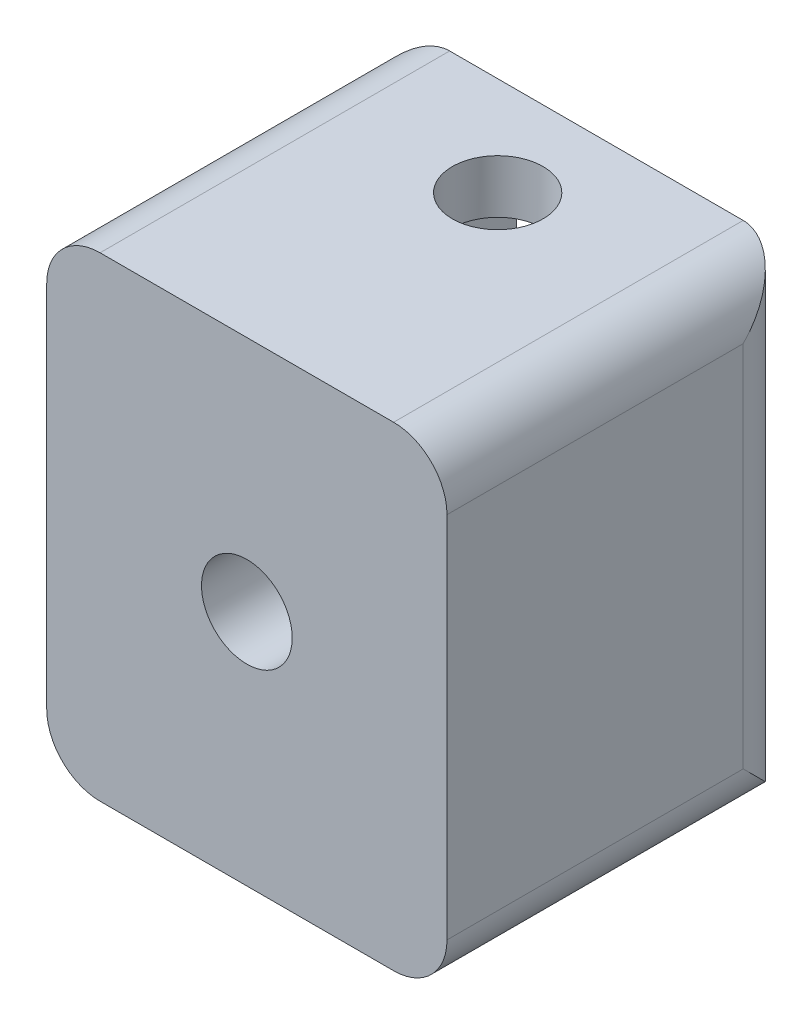
ISO-10303-21;
HEADER;
FILE_DESCRIPTION(('STEP AP214'),'2;1');
FILE_NAME('part.step','',(''),(''),'','','');
FILE_SCHEMA(('AUTOMOTIVE_DESIGN { 1 0 10303 214 1 1 1 1 }'));
ENDSEC;
DATA;
#1=APPLICATION_CONTEXT('core data for automotive mechanical design processes');
#2=APPLICATION_PROTOCOL_DEFINITION('international standard','automotive_design',2000,#1);
#3=PRODUCT_CONTEXT('',#1,'mechanical');
#4=PRODUCT('Part','Part','',(#3));
#5=PRODUCT_RELATED_PRODUCT_CATEGORY('part','',(#4));
#6=PRODUCT_DEFINITION_FORMATION('','',#4);
#7=PRODUCT_DEFINITION_CONTEXT('part definition',#1,'design');
#8=PRODUCT_DEFINITION('design','',#6,#7);
#9=PRODUCT_DEFINITION_SHAPE('','',#8);
#10=(LENGTH_UNIT() NAMED_UNIT(*) SI_UNIT(.MILLI.,.METRE.));
#11=(NAMED_UNIT(*) PLANE_ANGLE_UNIT() SI_UNIT($,.RADIAN.));
#12=(NAMED_UNIT(*) SI_UNIT($,.STERADIAN.) SOLID_ANGLE_UNIT());
#13=UNCERTAINTY_MEASURE_WITH_UNIT(LENGTH_MEASURE(1.E-05),#10,'distance_accuracy_value','');
#14=(GEOMETRIC_REPRESENTATION_CONTEXT(3) GLOBAL_UNCERTAINTY_ASSIGNED_CONTEXT((#13)) GLOBAL_UNIT_ASSIGNED_CONTEXT((#10,
#11,#12)) REPRESENTATION_CONTEXT('',''));
#15=CARTESIAN_POINT('',(0.,0.,0.));
#16=DIRECTION('',(0.,0.,1.));
#17=DIRECTION('',(1.,0.,0.));
#18=AXIS2_PLACEMENT_3D('',#15,#16,#17);
#19=CARTESIAN_POINT('',(0.,0.,0.));
#20=DIRECTION('',(0.,0.,1.));
#21=DIRECTION('',(1.,0.,0.));
#22=AXIS2_PLACEMENT_3D('',#19,#20,#21);
#23=PLANE('',#22);
#24=CARTESIAN_POINT('',(0.,0.,0.));
#25=DIRECTION('',(0.,0.,1.));
#26=DIRECTION('',(1.,0.,0.));
#27=AXIS2_PLACEMENT_3D('',#24,#25,#26);
#28=CIRCLE('',#27,1.7);
#29=CARTESIAN_POINT('',(1.7,0.,0.));
#30=VERTEX_POINT('',#29);
#31=EDGE_CURVE('E300',#30,#30,#28,.T.);
#32=ORIENTED_EDGE('',*,*,#31,.T.);
#33=EDGE_LOOP('',(#32));
#34=FACE_BOUND('',#33,.T.);
#35=CARTESIAN_POINT('',(0.,0.,0.));
#36=DIRECTION('',(0.,0.,1.));
#37=DIRECTION('',(1.,0.,0.));
#38=AXIS2_PLACEMENT_3D('',#35,#36,#37);
#39=CIRCLE('',#38,3.);
#40=CARTESIAN_POINT('',(3.,0.,0.));
#41=VERTEX_POINT('',#40);
#42=EDGE_CURVE('E314',#41,#41,#39,.T.);
#43=ORIENTED_EDGE('',*,*,#42,.F.);
#44=EDGE_LOOP('',(#43));
#45=FACE_BOUND('',#44,.T.);
#46=ADVANCED_FACE('F100',(#34,#45),#23,.F.);
#47=CARTESIAN_POINT('',(0.,-8.9,3.2));
#48=DIRECTION('',(0.,1.,0.));
#49=DIRECTION('',(0.,0.,1.));
#50=AXIS2_PLACEMENT_3D('',#47,#48,#49);
#51=PLANE('',#50);
#52=CARTESIAN_POINT('',(0.,-8.9,-6.2));
#53=DIRECTION('',(0.,1.,0.));
#54=DIRECTION('',(0.,0.,1.));
#55=AXIS2_PLACEMENT_3D('',#52,#53,#54);
#56=CIRCLE('',#55,1.7);
#57=CARTESIAN_POINT('',(0.,-8.9,-4.5));
#58=VERTEX_POINT('',#57);
#59=EDGE_CURVE('E324',#58,#58,#56,.T.);
#60=ORIENTED_EDGE('',*,*,#59,.T.);
#61=EDGE_LOOP('',(#60));
#62=FACE_BOUND('',#61,.T.);
#63=DIRECTION('',(1.,0.,0.));
#64=VECTOR('',#63,1.);
#65=CARTESIAN_POINT('',(0.,-8.9,3.2));
#66=LINE('',#65,#64);
#67=CARTESIAN_POINT('',(-5.5,-8.9,3.2));
#68=VERTEX_POINT('',#67);
#69=CARTESIAN_POINT('',(5.5,-8.9,3.2));
#70=VERTEX_POINT('',#69);
#71=EDGE_CURVE('E301',#68,#70,#66,.T.);
#72=ORIENTED_EDGE('',*,*,#71,.F.);
#73=DIRECTION('',(0.,0.,-1.));
#74=VECTOR('',#73,1.);
#75=CARTESIAN_POINT('',(-5.5,-8.9,-9.9));
#76=LINE('',#75,#74);
#77=CARTESIAN_POINT('',(-5.5,-8.9,-9.9));
#78=VERTEX_POINT('',#77);
#79=EDGE_CURVE('E344',#68,#78,#76,.T.);
#80=ORIENTED_EDGE('',*,*,#79,.T.);
#81=DIRECTION('',(1.,0.,0.));
#82=VECTOR('',#81,1.);
#83=CARTESIAN_POINT('',(0.,-8.9,-9.9));
#84=LINE('',#83,#82);
#85=CARTESIAN_POINT('',(5.5,-8.9,-9.9));
#86=VERTEX_POINT('',#85);
#87=EDGE_CURVE('E297',#78,#86,#84,.T.);
#88=ORIENTED_EDGE('',*,*,#87,.T.);
#89=DIRECTION('',(0.,0.,-1.));
#90=VECTOR('',#89,1.);
#91=CARTESIAN_POINT('',(5.5,-8.9,3.2));
#92=LINE('',#91,#90);
#93=EDGE_CURVE('E342',#86,#70,#92,.F.);
#94=ORIENTED_EDGE('',*,*,#93,.T.);
#95=EDGE_LOOP('',(#72,#80,#88,#94));
#96=FACE_BOUND('',#95,.T.);
#97=ADVANCED_FACE('F397',(#62,#96),#51,.F.);
#98=CARTESIAN_POINT('',(7.5,0.,3.2));
#99=DIRECTION('',(-1.,0.,0.));
#100=DIRECTION('',(0.,0.,1.));
#101=AXIS2_PLACEMENT_3D('',#98,#99,#100);
#102=PLANE('',#101);
#103=DIRECTION('',(0.,1.,0.));
#104=VECTOR('',#103,1.);
#105=CARTESIAN_POINT('',(7.5,0.,3.2));
#106=LINE('',#105,#104);
#107=CARTESIAN_POINT('',(7.5,-6.9,3.2));
#108=VERTEX_POINT('',#107);
#109=CARTESIAN_POINT('',(7.5,6.9,3.2));
#110=VERTEX_POINT('',#109);
#111=EDGE_CURVE('E304',#108,#110,#106,.T.);
#112=ORIENTED_EDGE('',*,*,#111,.F.);
#113=DIRECTION('',(0.,0.,-1.));
#114=VECTOR('',#113,1.);
#115=CARTESIAN_POINT('',(7.5,-6.9,3.2));
#116=LINE('',#115,#114);
#117=CARTESIAN_POINT('',(7.5,-6.9,-7.9));
#118=VERTEX_POINT('',#117);
#119=EDGE_CURVE('E329',#108,#118,#116,.T.);
#120=ORIENTED_EDGE('',*,*,#119,.T.);
#121=DIRECTION('',(0.,1.,0.));
#122=VECTOR('',#121,1.);
#123=CARTESIAN_POINT('',(7.5,0.,-7.9));
#124=LINE('',#123,#122);
#125=CARTESIAN_POINT('',(7.5,6.9,-7.9));
#126=VERTEX_POINT('',#125);
#127=EDGE_CURVE('E326',#118,#126,#124,.T.);
#128=ORIENTED_EDGE('',*,*,#127,.T.);
#129=DIRECTION('',(0.,0.,-1.));
#130=VECTOR('',#129,1.);
#131=CARTESIAN_POINT('',(7.5,6.9,3.2));
#132=LINE('',#131,#130);
#133=EDGE_CURVE('E319',#126,#110,#132,.F.);
#134=ORIENTED_EDGE('',*,*,#133,.T.);
#135=EDGE_LOOP('',(#112,#120,#128,#134));
#136=FACE_BOUND('',#135,.T.);
#137=ADVANCED_FACE('F404',(#136),#102,.F.);
#138=CARTESIAN_POINT('',(0.,8.9,3.2));
#139=DIRECTION('',(0.,1.,0.));
#140=DIRECTION('',(0.,0.,1.));
#141=AXIS2_PLACEMENT_3D('',#138,#139,#140);
#142=PLANE('',#141);
#143=CARTESIAN_POINT('',(0.,8.9,-6.2));
#144=DIRECTION('',(0.,1.,0.));
#145=DIRECTION('',(0.,0.,1.));
#146=AXIS2_PLACEMENT_3D('',#143,#144,#145);
#147=CIRCLE('',#146,1.7);
#148=CARTESIAN_POINT('',(0.,8.9,-4.5));
#149=VERTEX_POINT('',#148);
#150=EDGE_CURVE('E358',#149,#149,#147,.T.);
#151=ORIENTED_EDGE('',*,*,#150,.F.);
#152=EDGE_LOOP('',(#151));
#153=FACE_BOUND('',#152,.T.);
#154=DIRECTION('',(1.,0.,0.));
#155=VECTOR('',#154,1.);
#156=CARTESIAN_POINT('',(0.,8.9,3.2));
#157=LINE('',#156,#155);
#158=CARTESIAN_POINT('',(-5.5,8.9,3.2));
#159=VERTEX_POINT('',#158);
#160=CARTESIAN_POINT('',(5.5,8.9,3.2));
#161=VERTEX_POINT('',#160);
#162=EDGE_CURVE('E306',#159,#161,#157,.T.);
#163=ORIENTED_EDGE('',*,*,#162,.T.);
#164=DIRECTION('',(0.,0.,-1.));
#165=VECTOR('',#164,1.);
#166=CARTESIAN_POINT('',(5.5,8.9,-9.9));
#167=LINE('',#166,#165);
#168=CARTESIAN_POINT('',(5.5,8.9,-9.9));
#169=VERTEX_POINT('',#168);
#170=EDGE_CURVE('E12',#161,#169,#167,.T.);
#171=ORIENTED_EDGE('',*,*,#170,.T.);
#172=DIRECTION('',(1.,0.,0.));
#173=VECTOR('',#172,1.);
#174=CARTESIAN_POINT('',(0.,8.9,-9.9));
#175=LINE('',#174,#173);
#176=CARTESIAN_POINT('',(-5.5,8.9,-9.9));
#177=VERTEX_POINT('',#176);
#178=EDGE_CURVE('E294',#177,#169,#175,.T.);
#179=ORIENTED_EDGE('',*,*,#178,.F.);
#180=DIRECTION('',(0.,0.,-1.));
#181=VECTOR('',#180,1.);
#182=CARTESIAN_POINT('',(-5.5,8.9,3.2));
#183=LINE('',#182,#181);
#184=EDGE_CURVE('E109',#177,#159,#183,.F.);
#185=ORIENTED_EDGE('',*,*,#184,.T.);
#186=EDGE_LOOP('',(#163,#171,#179,#185));
#187=FACE_BOUND('',#186,.T.);
#188=ADVANCED_FACE('F385',(#153,#187),#142,.T.);
#189=CARTESIAN_POINT('',(-7.5,0.,3.2));
#190=DIRECTION('',(-1.,0.,0.));
#191=DIRECTION('',(0.,-1.,0.));
#192=AXIS2_PLACEMENT_3D('',#189,#190,#191);
#193=PLANE('',#192);
#194=DIRECTION('',(0.,1.,0.));
#195=VECTOR('',#194,1.);
#196=CARTESIAN_POINT('',(-7.5,-8.9,-7.9));
#197=LINE('',#196,#195);
#198=CARTESIAN_POINT('',(-7.5,6.9,-7.9));
#199=VERTEX_POINT('',#198);
#200=CARTESIAN_POINT('',(-7.5,-6.9,-7.9));
#201=VERTEX_POINT('',#200);
#202=EDGE_CURVE('E338',#199,#201,#197,.F.);
#203=ORIENTED_EDGE('',*,*,#202,.T.);
#204=DIRECTION('',(0.,0.,-1.));
#205=VECTOR('',#204,1.);
#206=CARTESIAN_POINT('',(-7.5,-6.9,3.2));
#207=LINE('',#206,#205);
#208=CARTESIAN_POINT('',(-7.5,-6.9,3.2));
#209=VERTEX_POINT('',#208);
#210=EDGE_CURVE('E340',#201,#209,#207,.F.);
#211=ORIENTED_EDGE('',*,*,#210,.T.);
#212=DIRECTION('',(0.,1.,0.));
#213=VECTOR('',#212,1.);
#214=CARTESIAN_POINT('',(-7.5,0.,3.2));
#215=LINE('',#214,#213);
#216=CARTESIAN_POINT('',(-7.5,6.9,3.2));
#217=VERTEX_POINT('',#216);
#218=EDGE_CURVE('E308',#209,#217,#215,.T.);
#219=ORIENTED_EDGE('',*,*,#218,.T.);
#220=DIRECTION('',(0.,0.,-1.));
#221=VECTOR('',#220,1.);
#222=CARTESIAN_POINT('',(-7.5,6.9,3.2));
#223=LINE('',#222,#221);
#224=EDGE_CURVE('E336',#217,#199,#223,.T.);
#225=ORIENTED_EDGE('',*,*,#224,.T.);
#226=EDGE_LOOP('',(#203,#211,#219,#225));
#227=FACE_BOUND('',#226,.T.);
#228=ADVANCED_FACE('F373',(#227),#193,.T.);
#229=CARTESIAN_POINT('',(0.,0.,3.2));
#230=DIRECTION('',(0.,0.,-1.));
#231=DIRECTION('',(-1.,0.,0.));
#232=AXIS2_PLACEMENT_3D('',#229,#230,#231);
#233=CYLINDRICAL_SURFACE('',#232,1.7);
#234=CARTESIAN_POINT('',(0.,0.,3.2));
#235=DIRECTION('',(0.,0.,1.));
#236=DIRECTION('',(1.,0.,0.));
#237=AXIS2_PLACEMENT_3D('',#234,#235,#236);
#238=CIRCLE('',#237,1.7);
#239=CARTESIAN_POINT('',(1.7,0.,3.2));
#240=VERTEX_POINT('',#239);
#241=EDGE_CURVE('E311',#240,#240,#238,.T.);
#242=ORIENTED_EDGE('',*,*,#241,.T.);
#243=EDGE_LOOP('',(#242));
#244=FACE_BOUND('',#243,.T.);
#245=ORIENTED_EDGE('',*,*,#31,.F.);
#246=EDGE_LOOP('',(#245));
#247=FACE_BOUND('',#246,.T.);
#248=ADVANCED_FACE('F424',(#244,#247),#233,.F.);
#249=CARTESIAN_POINT('',(0.,0.,3.2));
#250=DIRECTION('',(0.,0.,1.));
#251=DIRECTION('',(1.,0.,0.));
#252=AXIS2_PLACEMENT_3D('',#249,#250,#251);
#253=PLANE('',#252);
#254=ORIENTED_EDGE('',*,*,#218,.F.);
#255=CARTESIAN_POINT('',(-5.5,-6.9,3.2));
#256=DIRECTION('',(0.,0.,1.));
#257=DIRECTION('',(1.,0.,0.));
#258=AXIS2_PLACEMENT_3D('',#255,#256,#257);
#259=CIRCLE('',#258,2.);
#260=EDGE_CURVE('E351',#209,#68,#259,.T.);
#261=ORIENTED_EDGE('',*,*,#260,.T.);
#262=ORIENTED_EDGE('',*,*,#71,.T.);
#263=CARTESIAN_POINT('',(5.5,-6.9,3.2));
#264=DIRECTION('',(0.,0.,1.));
#265=DIRECTION('',(1.,0.,0.));
#266=AXIS2_PLACEMENT_3D('',#263,#264,#265);
#267=CIRCLE('',#266,2.);
#268=EDGE_CURVE('E349',#70,#108,#267,.T.);
#269=ORIENTED_EDGE('',*,*,#268,.T.);
#270=ORIENTED_EDGE('',*,*,#111,.T.);
#271=CARTESIAN_POINT('',(5.5,6.9,3.2));
#272=DIRECTION('',(0.,0.,1.));
#273=DIRECTION('',(1.,0.,0.));
#274=AXIS2_PLACEMENT_3D('',#271,#272,#273);
#275=CIRCLE('',#274,2.);
#276=EDGE_CURVE('E117',#110,#161,#275,.T.);
#277=ORIENTED_EDGE('',*,*,#276,.T.);
#278=ORIENTED_EDGE('',*,*,#162,.F.);
#279=CARTESIAN_POINT('',(-5.5,6.9,3.2));
#280=DIRECTION('',(0.,0.,1.));
#281=DIRECTION('',(1.,0.,0.));
#282=AXIS2_PLACEMENT_3D('',#279,#280,#281);
#283=CIRCLE('',#282,2.);
#284=EDGE_CURVE('E346',#159,#217,#283,.T.);
#285=ORIENTED_EDGE('',*,*,#284,.T.);
#286=EDGE_LOOP('',(#254,#261,#262,#269,#270,#277,#278,#285));
#287=FACE_BOUND('',#286,.T.);
#288=ORIENTED_EDGE('',*,*,#241,.F.);
#289=EDGE_LOOP('',(#288));
#290=FACE_BOUND('',#289,.T.);
#291=ADVANCED_FACE('F375',(#287,#290),#253,.T.);
#292=CARTESIAN_POINT('',(0.,0.,-2.2));
#293=DIRECTION('',(0.,0.,1.));
#294=DIRECTION('',(1.,0.,0.));
#295=AXIS2_PLACEMENT_3D('',#292,#293,#294);
#296=CYLINDRICAL_SURFACE('',#295,3.);
#297=CARTESIAN_POINT('',(0.,-3.,-4.5));
#298=CARTESIAN_POINT('',(-0.087769748824071,-2.99999133441048,-4.50001001302127));
#299=CARTESIAN_POINT('',(-0.17567864205041,-2.99610484286383,-4.50684452261692));
#300=CARTESIAN_POINT('',(-0.34889856559262,-2.98091941514981,-4.53386701959558));
#301=CARTESIAN_POINT('',(-0.434201989690229,-2.96960061132579,-4.55409079965465));
#302=CARTESIAN_POINT('',(-0.599325942968555,-2.94071411609451,-4.60680126796895));
#303=CARTESIAN_POINT('',(-0.679170429544021,-2.9231761424651,-4.63922968183565));
#304=CARTESIAN_POINT('',(-0.83207416680258,-2.88338392043332,-4.71509473385691));
#305=CARTESIAN_POINT('',(-0.905135493059391,-2.86113112160237,-4.75852798937859));
#306=CARTESIAN_POINT('',(-1.04831230094814,-2.81196934110111,-4.85865359766579));
#307=CARTESIAN_POINT('',(-1.11784339837088,-2.78484117688452,-4.91607206499214));
#308=CARTESIAN_POINT('',(-1.24685685372676,-2.7295212294157,-5.04093944937979));
#309=CARTESIAN_POINT('',(-1.30632738378244,-2.70132824124799,-5.10839999988891));
#310=CARTESIAN_POINT('',(-1.41992297442561,-2.64353840584553,-5.25993788416209));
#311=CARTESIAN_POINT('',(-1.47280545993796,-2.61411150105205,-5.34501959494441));
#312=CARTESIAN_POINT('',(-1.56328720131686,-2.56103499911283,-5.52457475561624));
#313=CARTESIAN_POINT('',(-1.60090930289246,-2.5373767872268,-5.61903390104459));
#314=CARTESIAN_POINT('',(-1.65263595894521,-2.50390264826698,-5.79357691757066));
#315=CARTESIAN_POINT('',(-1.67007871740792,-2.49219376746818,-5.87230803917536));
#316=CARTESIAN_POINT('',(-1.6936170181746,-2.47626182544847,-6.03216090289869));
#317=CARTESIAN_POINT('',(-1.69972442237452,-2.47203093909219,-6.1132800556231));
#318=CARTESIAN_POINT('',(-1.70025764589358,-2.47166423107446,-6.27567685955261));
#319=CARTESIAN_POINT('',(-1.69466851087201,-2.47553877241855,-6.35695458076414));
#320=CARTESIAN_POINT('',(-1.67210703110485,-2.49083036803125,-6.51719988938576));
#321=CARTESIAN_POINT('',(-1.65512697974366,-2.50225252862358,-6.59616587499947));
#322=CARTESIAN_POINT('',(-1.61067074302859,-2.53109280881299,-6.74964871567647));
#323=CARTESIAN_POINT('',(-1.58322166149742,-2.54849543385258,-6.82417648978703));
#324=CARTESIAN_POINT('',(-1.51877579625947,-2.58741848433329,-6.96780475216444));
#325=CARTESIAN_POINT('',(-1.48177533663829,-2.60894049432213,-7.03690313750868));
#326=CARTESIAN_POINT('',(-1.39252660037395,-2.65778923304395,-7.17928498561182));
#327=CARTESIAN_POINT('',(-1.33879365736398,-2.6854960569743,-7.25150872251174));
#328=CARTESIAN_POINT('',(-1.22067884956637,-2.74120648715254,-7.38659326326084));
#329=CARTESIAN_POINT('',(-1.15628810600205,-2.76921032247429,-7.44944617679779));
#330=CARTESIAN_POINT('',(-1.01018443470599,-2.82600742003747,-7.57095327943349));
#331=CARTESIAN_POINT('',(-0.927345136668149,-2.85454857400247,-7.62838475692861));
#332=CARTESIAN_POINT('',(-0.751430238435187,-2.90580846929353,-7.72825408888865));
#333=CARTESIAN_POINT('',(-0.658361243036545,-2.92853093625589,-7.77070154406953));
#334=CARTESIAN_POINT('',(-0.471324413272141,-2.96416437869922,-7.83614459788286));
#335=CARTESIAN_POINT('',(-0.377872223033326,-2.97764923776691,-7.8602906134547));
#336=CARTESIAN_POINT('',(-0.187413154262457,-2.99566244849969,-7.89238779118733));
#337=CARTESIAN_POINT('',(-0.0904097576028203,-3.00019934591041,-7.90035440569226));
#338=CARTESIAN_POINT('',(0.0919259967895206,-2.99981102609089,-7.89966420910069));
#339=CARTESIAN_POINT('',(0.177274920156342,-2.99594654122011,-7.8928709918962));
#340=CARTESIAN_POINT('',(0.345393803623234,-2.98124489000884,-7.86671490599234));
#341=CARTESIAN_POINT('',(0.428163706741118,-2.97040756972135,-7.84735175977264));
#342=CARTESIAN_POINT('',(0.588304818397609,-2.94286496071771,-7.79715006524612));
#343=CARTESIAN_POINT('',(0.665714686267076,-2.9262084514643,-7.76640678734121));
#344=CARTESIAN_POINT('',(0.814340102402539,-2.88837991117375,-7.69454695712939));
#345=CARTESIAN_POINT('',(0.885554104108607,-2.86720675725647,-7.65342782482213));
#346=CARTESIAN_POINT('',(1.02772843144586,-2.81956776700937,-7.55716324727036));
#347=CARTESIAN_POINT('',(1.0978940063197,-2.7927806119577,-7.50100449486271));
#348=CARTESIAN_POINT('',(1.22834989449523,-2.73791458360901,-7.37863042528812));
#349=CARTESIAN_POINT('',(1.28862885715301,-2.70983427236239,-7.31240371498034));
#350=CARTESIAN_POINT('',(1.40423788816632,-2.65192959309217,-7.16330412373663));
#351=CARTESIAN_POINT('',(1.45832500570602,-2.62224568984065,-7.0794052308477));
#352=CARTESIAN_POINT('',(1.55146998658469,-2.56823926470343,-6.90209221954916));
#353=CARTESIAN_POINT('',(1.59054828204758,-2.54390947346437,-6.80869125751055));
#354=CARTESIAN_POINT('',(1.6452980416674,-2.50874883027498,-6.63522604973517));
#355=CARTESIAN_POINT('',(1.66417578156714,-2.49614951263489,-6.55653362581216));
#356=CARTESIAN_POINT('',(1.69054924119699,-2.4783675493962,-6.3964763695366));
#357=CARTESIAN_POINT('',(1.6980574328103,-2.47317677731618,-6.31511456565394));
#358=CARTESIAN_POINT('',(1.70128209488391,-2.47096023336924,-6.1518988449479));
#359=CARTESIAN_POINT('',(1.69697770816998,-2.47394890371389,-6.07004431263478));
#360=CARTESIAN_POINT('',(1.67679068401484,-2.4876724871434,-5.90842651149311));
#361=CARTESIAN_POINT('',(1.66090067751292,-2.49841233033588,-5.82866460715243));
#362=CARTESIAN_POINT('',(1.61862347234917,-2.52600024321651,-5.67427228872578));
#363=CARTESIAN_POINT('',(1.59237324445538,-2.54276836606381,-5.59958925882284));
#364=CARTESIAN_POINT('',(1.53031664329114,-2.58059067537129,-5.45549146088765));
#365=CARTESIAN_POINT('',(1.49450668433325,-2.60164646935733,-5.38607868220771));
#366=CARTESIAN_POINT('',(1.40800700170692,-2.6495878885254,-5.24317126120797));
#367=CARTESIAN_POINT('',(1.35587801571102,-2.67687243529275,-5.17068107511503));
#368=CARTESIAN_POINT('',(1.24105328475233,-2.73200432741318,-5.03479213487606));
#369=CARTESIAN_POINT('',(1.17834866915542,-2.75985212781088,-4.97140109623583));
#370=CARTESIAN_POINT('',(1.03531315283816,-2.81686500519168,-4.84793781447853));
#371=CARTESIAN_POINT('',(0.95377487200129,-2.84579668881543,-4.78914359877583));
#372=CARTESIAN_POINT('',(0.780252265387208,-2.89816970384283,-4.686279522923));
#373=CARTESIAN_POINT('',(0.688273752759526,-2.92161406854795,-4.64220152211232));
#374=CARTESIAN_POINT('',(0.51342036340094,-2.95684004933314,-4.57719253527633));
#375=CARTESIAN_POINT('',(0.431817393281167,-2.96995172059379,-4.55354491535032));
#376=CARTESIAN_POINT('',(0.265357049293584,-2.98940630538783,-4.51870088252849));
#377=CARTESIAN_POINT('',(0.180510058040852,-2.99576920150795,-4.50746770727995));
#378=CARTESIAN_POINT('',(0.0635796404640904,-2.99949727152824,-4.50088853523745));
#379=CARTESIAN_POINT('',(0.0317989523530353,-3.00000313954036,-4.49999637228555));
#380=CARTESIAN_POINT('',(0.,-3.,-4.5));
#381=B_SPLINE_CURVE_WITH_KNOTS('',3,(#297,#298,#299,#300,#301,#302,#303,#304,#305,#306,#307,
#308,#309,#310,#311,#312,#313,#314,#315,#316,#317,#318,#319,#320,#321,#322,#323,#324,#325,#326,
#327,#328,#329,#330,#331,#332,#333,#334,#335,#336,#337,#338,#339,#340,#341,#342,#343,#344,#345,
#346,#347,#348,#349,#350,#351,#352,#353,#354,#355,#356,#357,#358,#359,#360,#361,#362,#363,#364,
#365,#366,#367,#368,#369,#370,#371,#372,#373,#374,#375,#376,#377,#378,#379,#380),.UNSPECIFIED.,
.T.,.F.,(4,2,2,2,2,2,2,2,2,2,2,2,2,2,2,2,2,2,2,2,2,2,2,2,2,2,2,2,2,2,2,2,2,2,2,2,2,2,2,2,2,4),
(0.,0.263210544962749,0.527127570281855,0.78980011711627,1.05239202224804,1.33376412117952,
1.61546475508406,1.92714699952873,2.23836089938046,2.48175939909108,2.72490305021011,
2.96835775695076,3.21197734125909,3.45497044096425,3.69805719804271,3.97949646812439,
4.26117139010841,4.57383573562972,4.88629938247038,5.17696500716158,5.46735289713071,
5.72321969411436,5.97909214034646,6.23286925043503,6.48670952557066,6.76691745867778,
7.04744487513936,7.3583531029457,7.66883656562139,7.9134810725709,8.15785702059688,
8.40266473460877,8.6476282951298,8.88945624817072,9.13137503438984,9.41036511208789,
9.68959037580461,10.0018215052174,10.3138796284996,10.5706814481181,10.826720756969,
10.9220818545023),.UNSPECIFIED.);
#382=CARTESIAN_POINT('',(0.,-3.,-4.5));
#383=VERTEX_POINT('',#382);
#384=EDGE_CURVE('E248',#383,#383,#381,.T.);
#385=ORIENTED_EDGE('',*,*,#384,.T.);
#386=EDGE_LOOP('',(#385));
#387=FACE_BOUND('',#386,.T.);
#388=CARTESIAN_POINT('',(0.,3.,-4.5));
#389=CARTESIAN_POINT('',(0.087769748824071,2.99999133441048,-4.50001001302127));
#390=CARTESIAN_POINT('',(0.17567864205041,2.99610484286383,-4.50684452261692));
#391=CARTESIAN_POINT('',(0.34889856559262,2.98091941514981,-4.53386701959558));
#392=CARTESIAN_POINT('',(0.434201989690229,2.96960061132579,-4.55409079965465));
#393=CARTESIAN_POINT('',(0.599325942968555,2.94071411609451,-4.60680126796895));
#394=CARTESIAN_POINT('',(0.679170429544021,2.9231761424651,-4.63922968183565));
#395=CARTESIAN_POINT('',(0.83207416680258,2.88338392043332,-4.71509473385691));
#396=CARTESIAN_POINT('',(0.905135493059391,2.86113112160237,-4.75852798937859));
#397=CARTESIAN_POINT('',(1.04831230094814,2.81196934110111,-4.85865359766579));
#398=CARTESIAN_POINT('',(1.11784339837088,2.78484117688452,-4.91607206499214));
#399=CARTESIAN_POINT('',(1.24685685372676,2.7295212294157,-5.04093944937979));
#400=CARTESIAN_POINT('',(1.30632738378244,2.70132824124799,-5.10839999988891));
#401=CARTESIAN_POINT('',(1.41992297442561,2.64353840584553,-5.25993788416209));
#402=CARTESIAN_POINT('',(1.47280545993796,2.61411150105205,-5.34501959494441));
#403=CARTESIAN_POINT('',(1.56328720131686,2.56103499911283,-5.52457475561624));
#404=CARTESIAN_POINT('',(1.60090930289246,2.5373767872268,-5.61903390104459));
#405=CARTESIAN_POINT('',(1.65263595894521,2.50390264826698,-5.79357691757066));
#406=CARTESIAN_POINT('',(1.67007871740792,2.49219376746818,-5.87230803917536));
#407=CARTESIAN_POINT('',(1.6936170181746,2.47626182544847,-6.03216090289869));
#408=CARTESIAN_POINT('',(1.69972442237452,2.47203093909219,-6.1132800556231));
#409=CARTESIAN_POINT('',(1.70025764589358,2.47166423107446,-6.27567685955261));
#410=CARTESIAN_POINT('',(1.69466851087201,2.47553877241855,-6.35695458076414));
#411=CARTESIAN_POINT('',(1.67210703110485,2.49083036803125,-6.51719988938576));
#412=CARTESIAN_POINT('',(1.65512697974366,2.50225252862358,-6.59616587499947));
#413=CARTESIAN_POINT('',(1.61067074302859,2.53109280881299,-6.74964871567647));
#414=CARTESIAN_POINT('',(1.58322166149742,2.54849543385258,-6.82417648978703));
#415=CARTESIAN_POINT('',(1.51877579625947,2.58741848433329,-6.96780475216444));
#416=CARTESIAN_POINT('',(1.48177533663829,2.60894049432213,-7.03690313750868));
#417=CARTESIAN_POINT('',(1.39252660037395,2.65778923304395,-7.17928498561182));
#418=CARTESIAN_POINT('',(1.33879365736398,2.6854960569743,-7.25150872251174));
#419=CARTESIAN_POINT('',(1.22067884956637,2.74120648715254,-7.38659326326084));
#420=CARTESIAN_POINT('',(1.15628810600205,2.76921032247429,-7.44944617679779));
#421=CARTESIAN_POINT('',(1.01018443470599,2.82600742003747,-7.57095327943349));
#422=CARTESIAN_POINT('',(0.927345136668149,2.85454857400247,-7.62838475692861));
#423=CARTESIAN_POINT('',(0.751430238435187,2.90580846929353,-7.72825408888865));
#424=CARTESIAN_POINT('',(0.658361243036545,2.92853093625589,-7.77070154406953));
#425=CARTESIAN_POINT('',(0.471324413272141,2.96416437869922,-7.83614459788286));
#426=CARTESIAN_POINT('',(0.377872223033326,2.97764923776691,-7.8602906134547));
#427=CARTESIAN_POINT('',(0.187413154262457,2.99566244849969,-7.89238779118733));
#428=CARTESIAN_POINT('',(0.0904097576028203,3.00019934591041,-7.90035440569226));
#429=CARTESIAN_POINT('',(-0.0919259967895206,2.99981102609089,-7.89966420910069));
#430=CARTESIAN_POINT('',(-0.177274920156342,2.99594654122011,-7.8928709918962));
#431=CARTESIAN_POINT('',(-0.345393803623234,2.98124489000884,-7.86671490599234));
#432=CARTESIAN_POINT('',(-0.428163706741118,2.97040756972135,-7.84735175977264));
#433=CARTESIAN_POINT('',(-0.588304818397609,2.94286496071771,-7.79715006524612));
#434=CARTESIAN_POINT('',(-0.665714686267076,2.9262084514643,-7.76640678734121));
#435=CARTESIAN_POINT('',(-0.814340102402539,2.88837991117375,-7.69454695712939));
#436=CARTESIAN_POINT('',(-0.885554104108607,2.86720675725647,-7.65342782482213));
#437=CARTESIAN_POINT('',(-1.02772843144586,2.81956776700937,-7.55716324727036));
#438=CARTESIAN_POINT('',(-1.0978940063197,2.7927806119577,-7.50100449486271));
#439=CARTESIAN_POINT('',(-1.22834989449523,2.73791458360901,-7.37863042528812));
#440=CARTESIAN_POINT('',(-1.28862885715301,2.70983427236239,-7.31240371498034));
#441=CARTESIAN_POINT('',(-1.40423788816632,2.65192959309217,-7.16330412373663));
#442=CARTESIAN_POINT('',(-1.45832500570602,2.62224568984065,-7.0794052308477));
#443=CARTESIAN_POINT('',(-1.55146998658469,2.56823926470343,-6.90209221954916));
#444=CARTESIAN_POINT('',(-1.59054828204758,2.54390947346437,-6.80869125751055));
#445=CARTESIAN_POINT('',(-1.6452980416674,2.50874883027498,-6.63522604973517));
#446=CARTESIAN_POINT('',(-1.66417578156714,2.49614951263489,-6.55653362581216));
#447=CARTESIAN_POINT('',(-1.69054924119699,2.4783675493962,-6.3964763695366));
#448=CARTESIAN_POINT('',(-1.6980574328103,2.47317677731618,-6.31511456565394));
#449=CARTESIAN_POINT('',(-1.70128209488391,2.47096023336924,-6.1518988449479));
#450=CARTESIAN_POINT('',(-1.69697770816998,2.47394890371389,-6.07004431263478));
#451=CARTESIAN_POINT('',(-1.67679068401484,2.4876724871434,-5.90842651149311));
#452=CARTESIAN_POINT('',(-1.66090067751292,2.49841233033588,-5.82866460715243));
#453=CARTESIAN_POINT('',(-1.61862347234917,2.52600024321651,-5.67427228872578));
#454=CARTESIAN_POINT('',(-1.59237324445538,2.54276836606381,-5.59958925882284));
#455=CARTESIAN_POINT('',(-1.53031664329114,2.58059067537129,-5.45549146088765));
#456=CARTESIAN_POINT('',(-1.49450668433325,2.60164646935733,-5.38607868220771));
#457=CARTESIAN_POINT('',(-1.40800700170692,2.6495878885254,-5.24317126120797));
#458=CARTESIAN_POINT('',(-1.35587801571102,2.67687243529275,-5.17068107511503));
#459=CARTESIAN_POINT('',(-1.24105328475233,2.73200432741318,-5.03479213487606));
#460=CARTESIAN_POINT('',(-1.17834866915542,2.75985212781088,-4.97140109623583));
#461=CARTESIAN_POINT('',(-1.03531315283816,2.81686500519168,-4.84793781447853));
#462=CARTESIAN_POINT('',(-0.95377487200129,2.84579668881543,-4.78914359877583));
#463=CARTESIAN_POINT('',(-0.780252265387208,2.89816970384283,-4.686279522923));
#464=CARTESIAN_POINT('',(-0.688273752759526,2.92161406854795,-4.64220152211232));
#465=CARTESIAN_POINT('',(-0.51342036340094,2.95684004933314,-4.57719253527633));
#466=CARTESIAN_POINT('',(-0.431817393281167,2.96995172059379,-4.55354491535032));
#467=CARTESIAN_POINT('',(-0.265357049293584,2.98940630538783,-4.51870088252849));
#468=CARTESIAN_POINT('',(-0.180510058040852,2.99576920150795,-4.50746770727995));
#469=CARTESIAN_POINT('',(-0.0635796404640904,2.99949727152824,-4.50088853523745));
#470=CARTESIAN_POINT('',(-0.0317989523530353,3.00000313954036,-4.49999637228555));
#471=CARTESIAN_POINT('',(0.,3.,-4.5));
#472=B_SPLINE_CURVE_WITH_KNOTS('',3,(#388,#389,#390,#391,#392,#393,#394,#395,#396,#397,#398,
#399,#400,#401,#402,#403,#404,#405,#406,#407,#408,#409,#410,#411,#412,#413,#414,#415,#416,#417,
#418,#419,#420,#421,#422,#423,#424,#425,#426,#427,#428,#429,#430,#431,#432,#433,#434,#435,#436,
#437,#438,#439,#440,#441,#442,#443,#444,#445,#446,#447,#448,#449,#450,#451,#452,#453,#454,#455,
#456,#457,#458,#459,#460,#461,#462,#463,#464,#465,#466,#467,#468,#469,#470,#471),.UNSPECIFIED.,
.T.,.F.,(4,2,2,2,2,2,2,2,2,2,2,2,2,2,2,2,2,2,2,2,2,2,2,2,2,2,2,2,2,2,2,2,2,2,2,2,2,2,2,2,2,4),
(0.,0.263210544962749,0.527127570281855,0.78980011711627,1.05239202224804,1.33376412117952,
1.61546475508406,1.92714699952873,2.23836089938046,2.48175939909108,2.72490305021011,
2.96835775695076,3.21197734125909,3.45497044096425,3.69805719804271,3.97949646812439,
4.26117139010841,4.57383573562972,4.88629938247038,5.17696500716158,5.46735289713071,
5.72321969411436,5.97909214034646,6.23286925043503,6.48670952557066,6.76691745867778,
7.04744487513936,7.3583531029457,7.66883656562139,7.9134810725709,8.15785702059688,
8.40266473460877,8.6476282951298,8.88945624817072,9.13137503438984,9.41036511208789,
9.68959037580461,10.0018215052174,10.3138796284996,10.5706814481181,10.826720756969,
10.9220818545023),.UNSPECIFIED.);
#473=CARTESIAN_POINT('',(0.,3.,-4.5));
#474=VERTEX_POINT('',#473);
#475=EDGE_CURVE('E702',#474,#474,#472,.T.);
#476=ORIENTED_EDGE('',*,*,#475,.T.);
#477=EDGE_LOOP('',(#476));
#478=FACE_BOUND('',#477,.T.);
#479=ORIENTED_EDGE('',*,*,#42,.T.);
#480=EDGE_LOOP('',(#479));
#481=FACE_BOUND('',#480,.T.);
#482=CARTESIAN_POINT('',(0.,0.,-9.9));
#483=DIRECTION('',(0.,0.,1.));
#484=DIRECTION('',(1.,0.,0.));
#485=AXIS2_PLACEMENT_3D('',#482,#483,#484);
#486=CIRCLE('',#485,3.);
#487=CARTESIAN_POINT('',(3.,0.,-9.9));
#488=VERTEX_POINT('',#487);
#489=EDGE_CURVE('E283',#488,#488,#486,.T.);
#490=ORIENTED_EDGE('',*,*,#489,.F.);
#491=EDGE_LOOP('',(#490));
#492=FACE_BOUND('',#491,.T.);
#493=ADVANCED_FACE('F443',(#387,#478,#481,#492),#296,.F.);
#494=CARTESIAN_POINT('',(0.,0.,-9.9));
#495=DIRECTION('',(0.,0.,1.));
#496=DIRECTION('',(1.,0.,0.));
#497=AXIS2_PLACEMENT_3D('',#494,#495,#496);
#498=PLANE('',#497);
#499=ORIENTED_EDGE('',*,*,#178,.T.);
#500=DIRECTION('',(0.,1.,0.));
#501=VECTOR('',#500,1.);
#502=CARTESIAN_POINT('',(5.5,0.,-9.9));
#503=LINE('',#502,#501);
#504=EDGE_CURVE('E334',#169,#86,#503,.F.);
#505=ORIENTED_EDGE('',*,*,#504,.T.);
#506=ORIENTED_EDGE('',*,*,#87,.F.);
#507=DIRECTION('',(0.,1.,0.));
#508=VECTOR('',#507,1.);
#509=CARTESIAN_POINT('',(-5.5,8.9,-9.9));
#510=LINE('',#509,#508);
#511=EDGE_CURVE('E331',#78,#177,#510,.T.);
#512=ORIENTED_EDGE('',*,*,#511,.T.);
#513=EDGE_LOOP('',(#499,#505,#506,#512));
#514=FACE_BOUND('',#513,.T.);
#515=ORIENTED_EDGE('',*,*,#489,.T.);
#516=EDGE_LOOP('',(#515));
#517=FACE_BOUND('',#516,.T.);
#518=DIRECTION('',(1.,0.,0.));
#519=VECTOR('',#518,1.);
#520=CARTESIAN_POINT('',(0.,6.9,-9.9));
#521=LINE('',#520,#519);
#522=CARTESIAN_POINT('',(-3.,6.9,-9.9));
#523=VERTEX_POINT('',#522);
#524=CARTESIAN_POINT('',(3.,6.9,-9.9));
#525=VERTEX_POINT('',#524);
#526=EDGE_CURVE('E269',#523,#525,#521,.T.);
#527=ORIENTED_EDGE('',*,*,#526,.F.);
#528=DIRECTION('',(0.,-1.,0.));
#529=VECTOR('',#528,1.);
#530=CARTESIAN_POINT('',(-3.,0.,-9.9));
#531=LINE('',#530,#529);
#532=CARTESIAN_POINT('',(-3.,4.,-9.9));
#533=VERTEX_POINT('',#532);
#534=EDGE_CURVE('E259',#523,#533,#531,.T.);
#535=ORIENTED_EDGE('',*,*,#534,.T.);
#536=DIRECTION('',(1.,0.,0.));
#537=VECTOR('',#536,1.);
#538=CARTESIAN_POINT('',(0.,4.,-9.9));
#539=LINE('',#538,#537);
#540=CARTESIAN_POINT('',(3.,4.,-9.9));
#541=VERTEX_POINT('',#540);
#542=EDGE_CURVE('E262',#533,#541,#539,.T.);
#543=ORIENTED_EDGE('',*,*,#542,.T.);
#544=DIRECTION('',(0.,-1.,0.));
#545=VECTOR('',#544,1.);
#546=CARTESIAN_POINT('',(3.,0.,-9.9));
#547=LINE('',#546,#545);
#548=EDGE_CURVE('E266',#525,#541,#547,.T.);
#549=ORIENTED_EDGE('',*,*,#548,.F.);
#550=EDGE_LOOP('',(#527,#535,#543,#549));
#551=FACE_BOUND('',#550,.T.);
#552=DIRECTION('',(1.,0.,0.));
#553=VECTOR('',#552,1.);
#554=CARTESIAN_POINT('',(0.,-4.,-9.9));
#555=LINE('',#554,#553);
#556=CARTESIAN_POINT('',(-3.,-4.,-9.9));
#557=VERTEX_POINT('',#556);
#558=CARTESIAN_POINT('',(3.,-4.,-9.9));
#559=VERTEX_POINT('',#558);
#560=EDGE_CURVE('E215',#557,#559,#555,.T.);
#561=ORIENTED_EDGE('',*,*,#560,.F.);
#562=DIRECTION('',(0.,1.,0.));
#563=VECTOR('',#562,1.);
#564=CARTESIAN_POINT('',(-3.,0.,-9.9));
#565=LINE('',#564,#563);
#566=CARTESIAN_POINT('',(-3.,-6.9,-9.9));
#567=VERTEX_POINT('',#566);
#568=EDGE_CURVE('E241',#567,#557,#565,.T.);
#569=ORIENTED_EDGE('',*,*,#568,.F.);
#570=DIRECTION('',(1.,0.,0.));
#571=VECTOR('',#570,1.);
#572=CARTESIAN_POINT('',(0.,-6.9,-9.9));
#573=LINE('',#572,#571);
#574=CARTESIAN_POINT('',(3.,-6.9,-9.9));
#575=VERTEX_POINT('',#574);
#576=EDGE_CURVE('E239',#567,#575,#573,.T.);
#577=ORIENTED_EDGE('',*,*,#576,.T.);
#578=DIRECTION('',(0.,1.,0.));
#579=VECTOR('',#578,1.);
#580=CARTESIAN_POINT('',(3.,0.,-9.9));
#581=LINE('',#580,#579);
#582=EDGE_CURVE('E225',#575,#559,#581,.T.);
#583=ORIENTED_EDGE('',*,*,#582,.T.);
#584=EDGE_LOOP('',(#561,#569,#577,#583));
#585=FACE_BOUND('',#584,.T.);
#586=ADVANCED_FACE('F238',(#514,#517,#551,#585),#498,.F.);
#587=CARTESIAN_POINT('',(-3.,0.,-9.9));
#588=DIRECTION('',(-1.,0.,0.));
#589=DIRECTION('',(0.,-1.,0.));
#590=AXIS2_PLACEMENT_3D('',#587,#588,#589);
#591=PLANE('',#590);
#592=DIRECTION('',(0.,-1.,0.));
#593=VECTOR('',#592,1.);
#594=CARTESIAN_POINT('',(-3.,0.,-2.2));
#595=LINE('',#594,#593);
#596=CARTESIAN_POINT('',(-3.,6.9,-2.2));
#597=VERTEX_POINT('',#596);
#598=CARTESIAN_POINT('',(-3.,4.,-2.2));
#599=VERTEX_POINT('',#598);
#600=EDGE_CURVE('E235',#597,#599,#595,.T.);
#601=ORIENTED_EDGE('',*,*,#600,.T.);
#602=DIRECTION('',(0.,0.,1.));
#603=VECTOR('',#602,1.);
#604=CARTESIAN_POINT('',(-3.,4.,-9.9));
#605=LINE('',#604,#603);
#606=EDGE_CURVE('E271',#533,#599,#605,.T.);
#607=ORIENTED_EDGE('',*,*,#606,.F.);
#608=ORIENTED_EDGE('',*,*,#534,.F.);
#609=DIRECTION('',(0.,0.,1.));
#610=VECTOR('',#609,1.);
#611=CARTESIAN_POINT('',(-3.,6.9,-9.9));
#612=LINE('',#611,#610);
#613=EDGE_CURVE('E280',#523,#597,#612,.T.);
#614=ORIENTED_EDGE('',*,*,#613,.T.);
#615=EDGE_LOOP('',(#601,#607,#608,#614));
#616=FACE_BOUND('',#615,.T.);
#617=ADVANCED_FACE('F457',(#616),#591,.F.);
#618=CARTESIAN_POINT('',(0.,6.9,-9.9));
#619=DIRECTION('',(0.,-1.,0.));
#620=DIRECTION('',(0.,0.,-1.));
#621=AXIS2_PLACEMENT_3D('',#618,#619,#620);
#622=PLANE('',#621);
#623=CARTESIAN_POINT('',(0.,6.9,-6.2));
#624=DIRECTION('',(0.,-1.,0.));
#625=DIRECTION('',(0.,0.,-1.));
#626=AXIS2_PLACEMENT_3D('',#623,#624,#625);
#627=CIRCLE('',#626,1.7);
#628=CARTESIAN_POINT('',(0.,6.9,-7.9));
#629=VERTEX_POINT('',#628);
#630=EDGE_CURVE('E713',#629,#629,#627,.T.);
#631=ORIENTED_EDGE('',*,*,#630,.F.);
#632=EDGE_LOOP('',(#631));
#633=FACE_BOUND('',#632,.T.);
#634=DIRECTION('',(1.,0.,0.));
#635=VECTOR('',#634,1.);
#636=CARTESIAN_POINT('',(0.,6.9,-2.2));
#637=LINE('',#636,#635);
#638=CARTESIAN_POINT('',(3.,6.9,-2.2));
#639=VERTEX_POINT('',#638);
#640=EDGE_CURVE('E263',#597,#639,#637,.T.);
#641=ORIENTED_EDGE('',*,*,#640,.F.);
#642=ORIENTED_EDGE('',*,*,#613,.F.);
#643=ORIENTED_EDGE('',*,*,#526,.T.);
#644=DIRECTION('',(0.,0.,1.));
#645=VECTOR('',#644,1.);
#646=CARTESIAN_POINT('',(3.,6.9,-9.9));
#647=LINE('',#646,#645);
#648=EDGE_CURVE('E284',#525,#639,#647,.T.);
#649=ORIENTED_EDGE('',*,*,#648,.T.);
#650=EDGE_LOOP('',(#641,#642,#643,#649));
#651=FACE_BOUND('',#650,.T.);
#652=ADVANCED_FACE('F465',(#633,#651),#622,.T.);
#653=CARTESIAN_POINT('',(3.,0.,-9.9));
#654=DIRECTION('',(-1.,0.,0.));
#655=DIRECTION('',(0.,0.,1.));
#656=AXIS2_PLACEMENT_3D('',#653,#654,#655);
#657=PLANE('',#656);
#658=DIRECTION('',(0.,-1.,0.));
#659=VECTOR('',#658,1.);
#660=CARTESIAN_POINT('',(3.,0.,-2.2));
#661=LINE('',#660,#659);
#662=CARTESIAN_POINT('',(3.,4.,-2.2));
#663=VERTEX_POINT('',#662);
#664=EDGE_CURVE('E277',#639,#663,#661,.T.);
#665=ORIENTED_EDGE('',*,*,#664,.F.);
#666=ORIENTED_EDGE('',*,*,#648,.F.);
#667=ORIENTED_EDGE('',*,*,#548,.T.);
#668=DIRECTION('',(0.,0.,1.));
#669=VECTOR('',#668,1.);
#670=CARTESIAN_POINT('',(3.,4.,-9.9));
#671=LINE('',#670,#669);
#672=EDGE_CURVE('E287',#541,#663,#671,.T.);
#673=ORIENTED_EDGE('',*,*,#672,.T.);
#674=EDGE_LOOP('',(#665,#666,#667,#673));
#675=FACE_BOUND('',#674,.T.);
#676=ADVANCED_FACE('F473',(#675),#657,.T.);
#677=CARTESIAN_POINT('',(0.,4.,-9.9));
#678=DIRECTION('',(0.,-1.,0.));
#679=DIRECTION('',(0.,0.,-1.));
#680=AXIS2_PLACEMENT_3D('',#677,#678,#679);
#681=PLANE('',#680);
#682=CARTESIAN_POINT('',(0.,4.,-6.2));
#683=DIRECTION('',(0.,-1.,0.));
#684=DIRECTION('',(0.,0.,-1.));
#685=AXIS2_PLACEMENT_3D('',#682,#683,#684);
#686=CIRCLE('',#685,1.7);
#687=CARTESIAN_POINT('',(0.,4.,-7.9));
#688=VERTEX_POINT('',#687);
#689=EDGE_CURVE('E716',#688,#688,#686,.T.);
#690=ORIENTED_EDGE('',*,*,#689,.T.);
#691=EDGE_LOOP('',(#690));
#692=FACE_BOUND('',#691,.T.);
#693=DIRECTION('',(1.,0.,0.));
#694=VECTOR('',#693,1.);
#695=CARTESIAN_POINT('',(0.,4.,-2.2));
#696=LINE('',#695,#694);
#697=EDGE_CURVE('E274',#599,#663,#696,.T.);
#698=ORIENTED_EDGE('',*,*,#697,.T.);
#699=ORIENTED_EDGE('',*,*,#672,.F.);
#700=ORIENTED_EDGE('',*,*,#542,.F.);
#701=ORIENTED_EDGE('',*,*,#606,.T.);
#702=EDGE_LOOP('',(#698,#699,#700,#701));
#703=FACE_BOUND('',#702,.T.);
#704=ADVANCED_FACE('F481',(#692,#703),#681,.F.);
#705=CARTESIAN_POINT('',(0.,-4.,-9.9));
#706=DIRECTION('',(0.,-1.,0.));
#707=DIRECTION('',(0.,0.,-1.));
#708=AXIS2_PLACEMENT_3D('',#705,#706,#707);
#709=PLANE('',#708);
#710=CARTESIAN_POINT('',(0.,-4.,-6.2));
#711=DIRECTION('',(0.,-1.,0.));
#712=DIRECTION('',(0.,0.,-1.));
#713=AXIS2_PLACEMENT_3D('',#710,#711,#712);
#714=CIRCLE('',#713,1.7);
#715=CARTESIAN_POINT('',(0.,-4.,-7.9));
#716=VERTEX_POINT('',#715);
#717=EDGE_CURVE('E323',#716,#716,#714,.T.);
#718=ORIENTED_EDGE('',*,*,#717,.F.);
#719=EDGE_LOOP('',(#718));
#720=FACE_BOUND('',#719,.T.);
#721=DIRECTION('',(1.,0.,0.));
#722=VECTOR('',#721,1.);
#723=CARTESIAN_POINT('',(0.,-4.,-2.2));
#724=LINE('',#723,#722);
#725=CARTESIAN_POINT('',(-3.,-4.,-2.2));
#726=VERTEX_POINT('',#725);
#727=CARTESIAN_POINT('',(3.,-4.,-2.2));
#728=VERTEX_POINT('',#727);
#729=EDGE_CURVE('E246',#726,#728,#724,.T.);
#730=ORIENTED_EDGE('',*,*,#729,.F.);
#731=DIRECTION('',(0.,0.,1.));
#732=VECTOR('',#731,1.);
#733=CARTESIAN_POINT('',(-3.,-4.,-9.9));
#734=LINE('',#733,#732);
#735=EDGE_CURVE('E221',#557,#726,#734,.T.);
#736=ORIENTED_EDGE('',*,*,#735,.F.);
#737=ORIENTED_EDGE('',*,*,#560,.T.);
#738=DIRECTION('',(0.,0.,1.));
#739=VECTOR('',#738,1.);
#740=CARTESIAN_POINT('',(3.,-4.,-9.9));
#741=LINE('',#740,#739);
#742=EDGE_CURVE('E219',#559,#728,#741,.T.);
#743=ORIENTED_EDGE('',*,*,#742,.T.);
#744=EDGE_LOOP('',(#730,#736,#737,#743));
#745=FACE_BOUND('',#744,.T.);
#746=ADVANCED_FACE('F218',(#720,#745),#709,.T.);
#747=CARTESIAN_POINT('',(3.,0.,-9.9));
#748=DIRECTION('',(1.,0.,0.));
#749=DIRECTION('',(0.,0.,-1.));
#750=AXIS2_PLACEMENT_3D('',#747,#748,#749);
#751=PLANE('',#750);
#752=DIRECTION('',(0.,1.,0.));
#753=VECTOR('',#752,1.);
#754=CARTESIAN_POINT('',(3.,0.,-2.2));
#755=LINE('',#754,#753);
#756=CARTESIAN_POINT('',(3.,-6.9,-2.2));
#757=VERTEX_POINT('',#756);
#758=EDGE_CURVE('E233',#757,#728,#755,.T.);
#759=ORIENTED_EDGE('',*,*,#758,.T.);
#760=ORIENTED_EDGE('',*,*,#742,.F.);
#761=ORIENTED_EDGE('',*,*,#582,.F.);
#762=DIRECTION('',(0.,0.,1.));
#763=VECTOR('',#762,1.);
#764=CARTESIAN_POINT('',(3.,-6.9,-9.9));
#765=LINE('',#764,#763);
#766=EDGE_CURVE('E236',#575,#757,#765,.T.);
#767=ORIENTED_EDGE('',*,*,#766,.T.);
#768=EDGE_LOOP('',(#759,#760,#761,#767));
#769=FACE_BOUND('',#768,.T.);
#770=ADVANCED_FACE('F230',(#769),#751,.F.);
#771=CARTESIAN_POINT('',(0.,-6.9,-9.9));
#772=DIRECTION('',(0.,-1.,0.));
#773=DIRECTION('',(0.,0.,-1.));
#774=AXIS2_PLACEMENT_3D('',#771,#772,#773);
#775=PLANE('',#774);
#776=CARTESIAN_POINT('',(0.,-6.9,-6.2));
#777=DIRECTION('',(0.,-1.,0.));
#778=DIRECTION('',(0.,0.,-1.));
#779=AXIS2_PLACEMENT_3D('',#776,#777,#778);
#780=CIRCLE('',#779,1.7);
#781=CARTESIAN_POINT('',(0.,-6.9,-7.9));
#782=VERTEX_POINT('',#781);
#783=EDGE_CURVE('E320',#782,#782,#780,.T.);
#784=ORIENTED_EDGE('',*,*,#783,.T.);
#785=EDGE_LOOP('',(#784));
#786=FACE_BOUND('',#785,.T.);
#787=DIRECTION('',(1.,0.,0.));
#788=VECTOR('',#787,1.);
#789=CARTESIAN_POINT('',(0.,-6.9,-2.2));
#790=LINE('',#789,#788);
#791=CARTESIAN_POINT('',(-3.,-6.9,-2.2));
#792=VERTEX_POINT('',#791);
#793=EDGE_CURVE('E250',#792,#757,#790,.T.);
#794=ORIENTED_EDGE('',*,*,#793,.T.);
#795=ORIENTED_EDGE('',*,*,#766,.F.);
#796=ORIENTED_EDGE('',*,*,#576,.F.);
#797=DIRECTION('',(0.,0.,1.));
#798=VECTOR('',#797,1.);
#799=CARTESIAN_POINT('',(-3.,-6.9,-9.9));
#800=LINE('',#799,#798);
#801=EDGE_CURVE('E256',#567,#792,#800,.T.);
#802=ORIENTED_EDGE('',*,*,#801,.T.);
#803=EDGE_LOOP('',(#794,#795,#796,#802));
#804=FACE_BOUND('',#803,.T.);
#805=ADVANCED_FACE('F503',(#786,#804),#775,.F.);
#806=CARTESIAN_POINT('',(-3.,0.,-9.9));
#807=DIRECTION('',(1.,0.,0.));
#808=DIRECTION('',(0.,1.,0.));
#809=AXIS2_PLACEMENT_3D('',#806,#807,#808);
#810=PLANE('',#809);
#811=DIRECTION('',(0.,1.,0.));
#812=VECTOR('',#811,1.);
#813=CARTESIAN_POINT('',(-3.,0.,-2.2));
#814=LINE('',#813,#812);
#815=EDGE_CURVE('E226',#792,#726,#814,.T.);
#816=ORIENTED_EDGE('',*,*,#815,.F.);
#817=ORIENTED_EDGE('',*,*,#801,.F.);
#818=ORIENTED_EDGE('',*,*,#568,.T.);
#819=ORIENTED_EDGE('',*,*,#735,.T.);
#820=EDGE_LOOP('',(#816,#817,#818,#819));
#821=FACE_BOUND('',#820,.T.);
#822=ADVANCED_FACE('F510',(#821),#810,.T.);
#823=CARTESIAN_POINT('',(0.,0.,-2.2));
#824=DIRECTION('',(0.,0.,1.));
#825=DIRECTION('',(1.,0.,0.));
#826=AXIS2_PLACEMENT_3D('',#823,#824,#825);
#827=PLANE('',#826);
#828=ORIENTED_EDGE('',*,*,#600,.F.);
#829=ORIENTED_EDGE('',*,*,#640,.T.);
#830=ORIENTED_EDGE('',*,*,#664,.T.);
#831=ORIENTED_EDGE('',*,*,#697,.F.);
#832=EDGE_LOOP('',(#828,#829,#830,#831));
#833=FACE_BOUND('',#832,.T.);
#834=ADVANCED_FACE('F518',(#833),#827,.F.);
#835=ORIENTED_EDGE('',*,*,#815,.T.);
#836=ORIENTED_EDGE('',*,*,#729,.T.);
#837=ORIENTED_EDGE('',*,*,#758,.F.);
#838=ORIENTED_EDGE('',*,*,#793,.F.);
#839=EDGE_LOOP('',(#835,#836,#837,#838));
#840=FACE_BOUND('',#839,.T.);
#841=ADVANCED_FACE('F526',(#840),#827,.F.);
#842=CARTESIAN_POINT('',(0.,-8.9,-6.2));
#843=DIRECTION('',(0.,1.,0.));
#844=DIRECTION('',(0.,0.,1.));
#845=AXIS2_PLACEMENT_3D('',#842,#843,#844);
#846=CYLINDRICAL_SURFACE('',#845,1.7);
#847=ORIENTED_EDGE('',*,*,#59,.F.);
#848=EDGE_LOOP('',(#847));
#849=FACE_BOUND('',#848,.T.);
#850=ORIENTED_EDGE('',*,*,#783,.F.);
#851=EDGE_LOOP('',(#850));
#852=FACE_BOUND('',#851,.T.);
#853=ADVANCED_FACE('F533',(#849,#852),#846,.F.);
#854=ORIENTED_EDGE('',*,*,#717,.T.);
#855=EDGE_LOOP('',(#854));
#856=FACE_BOUND('',#855,.T.);
#857=ORIENTED_EDGE('',*,*,#384,.F.);
#858=EDGE_LOOP('',(#857));
#859=FACE_BOUND('',#858,.T.);
#860=ADVANCED_FACE('F539',(#856,#859),#846,.F.);
#861=ORIENTED_EDGE('',*,*,#689,.F.);
#862=EDGE_LOOP('',(#861));
#863=FACE_BOUND('',#862,.T.);
#864=ORIENTED_EDGE('',*,*,#475,.F.);
#865=EDGE_LOOP('',(#864));
#866=FACE_BOUND('',#865,.T.);
#867=ADVANCED_FACE('F543',(#863,#866),#846,.F.);
#868=ORIENTED_EDGE('',*,*,#630,.T.);
#869=EDGE_LOOP('',(#868));
#870=FACE_BOUND('',#869,.T.);
#871=ORIENTED_EDGE('',*,*,#150,.T.);
#872=EDGE_LOOP('',(#871));
#873=FACE_BOUND('',#872,.T.);
#874=ADVANCED_FACE('F542',(#870,#873),#846,.F.);
#875=CARTESIAN_POINT('',(5.5,-6.9,3.2));
#876=DIRECTION('',(0.,0.,-1.));
#877=DIRECTION('',(-1.,0.,0.));
#878=AXIS2_PLACEMENT_3D('',#875,#876,#877);
#879=CYLINDRICAL_SURFACE('',#878,2.);
#880=ORIENTED_EDGE('',*,*,#268,.F.);
#881=ORIENTED_EDGE('',*,*,#93,.F.);
#882=CARTESIAN_POINT('',(5.5,-6.9,-7.9));
#883=DIRECTION('',(0.,0.707106781186547,-0.707106781186547));
#884=DIRECTION('',(0.,-0.707106781186547,-0.707106781186547));
#885=AXIS2_PLACEMENT_3D('',#882,#883,#884);
#886=ELLIPSE('',#885,2.82842712474619,2.);
#887=EDGE_CURVE('E356',#118,#86,#886,.T.);
#888=ORIENTED_EDGE('',*,*,#887,.F.);
#889=ORIENTED_EDGE('',*,*,#119,.F.);
#890=EDGE_LOOP('',(#880,#881,#888,#889));
#891=FACE_BOUND('',#890,.T.);
#892=ADVANCED_FACE('F400',(#891),#879,.T.);
#893=CARTESIAN_POINT('',(5.5,6.9,3.2));
#894=DIRECTION('',(0.,0.,1.));
#895=DIRECTION('',(1.,0.,0.));
#896=AXIS2_PLACEMENT_3D('',#893,#894,#895);
#897=CYLINDRICAL_SURFACE('',#896,2.);
#898=ORIENTED_EDGE('',*,*,#276,.F.);
#899=ORIENTED_EDGE('',*,*,#133,.F.);
#900=CARTESIAN_POINT('',(5.5,6.9,-7.9));
#901=DIRECTION('',(0.,0.707106781186547,0.707106781186547));
#902=DIRECTION('',(0.,-0.707106781186547,0.707106781186547));
#903=AXIS2_PLACEMENT_3D('',#900,#901,#902);
#904=ELLIPSE('',#903,2.82842712474619,2.);
#905=EDGE_CURVE('E354',#169,#126,#904,.F.);
#906=ORIENTED_EDGE('',*,*,#905,.F.);
#907=ORIENTED_EDGE('',*,*,#170,.F.);
#908=EDGE_LOOP('',(#898,#899,#906,#907));
#909=FACE_BOUND('',#908,.T.);
#910=ADVANCED_FACE('F389',(#909),#897,.T.);
#911=CARTESIAN_POINT('',(5.5,0.,-7.9));
#912=DIRECTION('',(0.,1.,0.));
#913=DIRECTION('',(0.,0.,1.));
#914=AXIS2_PLACEMENT_3D('',#911,#912,#913);
#915=CYLINDRICAL_SURFACE('',#914,2.);
#916=ORIENTED_EDGE('',*,*,#887,.T.);
#917=ORIENTED_EDGE('',*,*,#504,.F.);
#918=ORIENTED_EDGE('',*,*,#905,.T.);
#919=ORIENTED_EDGE('',*,*,#127,.F.);
#920=EDGE_LOOP('',(#916,#917,#918,#919));
#921=FACE_BOUND('',#920,.T.);
#922=ADVANCED_FACE('F393',(#921),#915,.T.);
#923=CARTESIAN_POINT('',(-5.5,-6.9,3.2));
#924=DIRECTION('',(0.,0.,1.));
#925=DIRECTION('',(1.,0.,0.));
#926=AXIS2_PLACEMENT_3D('',#923,#924,#925);
#927=CYLINDRICAL_SURFACE('',#926,2.);
#928=ORIENTED_EDGE('',*,*,#260,.F.);
#929=ORIENTED_EDGE('',*,*,#210,.F.);
#930=CARTESIAN_POINT('',(-5.5,-6.9,-7.9));
#931=DIRECTION('',(0.,-0.707106781186547,0.707106781186547));
#932=DIRECTION('',(0.,0.707106781186547,0.707106781186547));
#933=AXIS2_PLACEMENT_3D('',#930,#931,#932);
#934=ELLIPSE('',#933,2.82842712474619,2.);
#935=EDGE_CURVE('E104',#78,#201,#934,.F.);
#936=ORIENTED_EDGE('',*,*,#935,.F.);
#937=ORIENTED_EDGE('',*,*,#79,.F.);
#938=EDGE_LOOP('',(#928,#929,#936,#937));
#939=FACE_BOUND('',#938,.T.);
#940=ADVANCED_FACE('F102',(#939),#927,.T.);
#941=CARTESIAN_POINT('',(-5.5,6.9,3.2));
#942=DIRECTION('',(0.,0.,-1.));
#943=DIRECTION('',(-1.,0.,0.));
#944=AXIS2_PLACEMENT_3D('',#941,#942,#943);
#945=CYLINDRICAL_SURFACE('',#944,2.);
#946=ORIENTED_EDGE('',*,*,#284,.F.);
#947=ORIENTED_EDGE('',*,*,#184,.F.);
#948=CARTESIAN_POINT('',(-5.5,6.9,-7.9));
#949=DIRECTION('',(0.,-0.707106781186547,-0.707106781186547));
#950=DIRECTION('',(0.,0.707106781186547,-0.707106781186547));
#951=AXIS2_PLACEMENT_3D('',#948,#949,#950);
#952=ELLIPSE('',#951,2.82842712474619,2.);
#953=EDGE_CURVE('E359',#199,#177,#952,.T.);
#954=ORIENTED_EDGE('',*,*,#953,.F.);
#955=ORIENTED_EDGE('',*,*,#224,.F.);
#956=EDGE_LOOP('',(#946,#947,#954,#955));
#957=FACE_BOUND('',#956,.T.);
#958=ADVANCED_FACE('F380',(#957),#945,.T.);
#959=CARTESIAN_POINT('',(-5.5,0.,-7.9));
#960=DIRECTION('',(0.,-1.,0.));
#961=DIRECTION('',(1.,0.,0.));
#962=AXIS2_PLACEMENT_3D('',#959,#960,#961);
#963=CYLINDRICAL_SURFACE('',#962,2.);
#964=ORIENTED_EDGE('',*,*,#935,.T.);
#965=ORIENTED_EDGE('',*,*,#202,.F.);
#966=ORIENTED_EDGE('',*,*,#953,.T.);
#967=ORIENTED_EDGE('',*,*,#511,.F.);
#968=EDGE_LOOP('',(#964,#965,#966,#967));
#969=FACE_BOUND('',#968,.T.);
#970=ADVANCED_FACE('F366',(#969),#963,.T.);
#971=CLOSED_SHELL('',(#46,#97,#137,#188,#228,#248,#291,#493,#586,#617,#652,#676,#704,#746,#770,
#805,#822,#834,#841,#853,#860,#867,#874,#892,#910,#922,#940,#958,#970));
#972=MANIFOLD_SOLID_BREP('B2',#971);
#973=ADVANCED_BREP_SHAPE_REPRESENTATION('',(#18,#972),#14);
#974=SHAPE_DEFINITION_REPRESENTATION(#9,#973);
ENDSEC;
END-ISO-10303-21;
